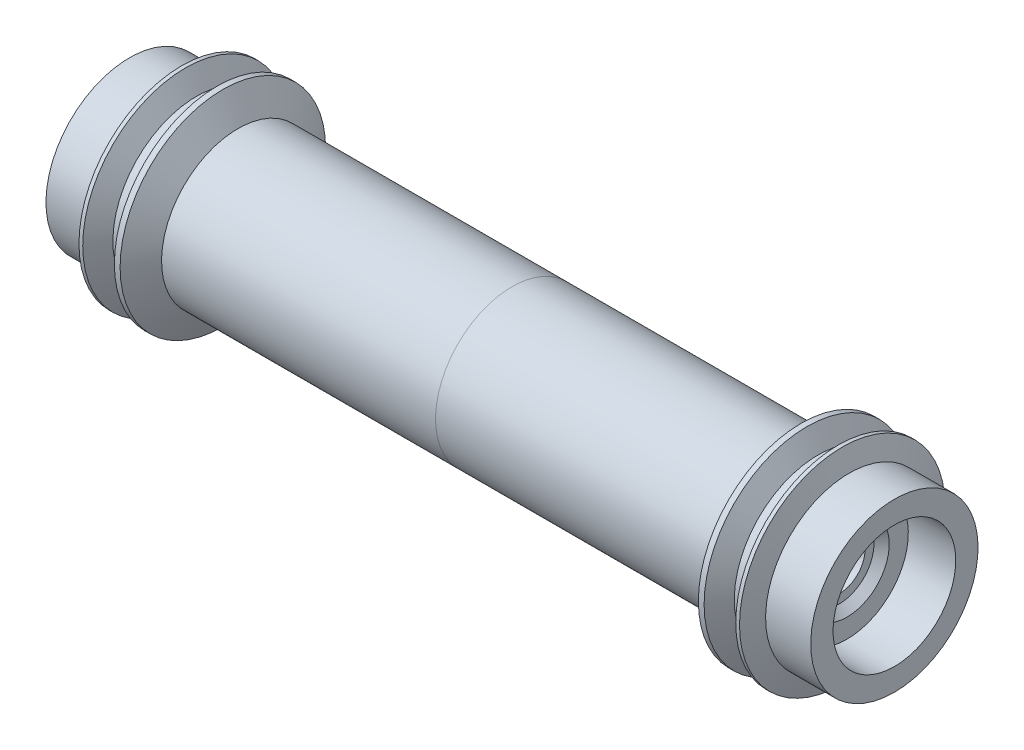
ISO-10303-21;
HEADER;
FILE_DESCRIPTION(('STEP AP214'),'2;1');
FILE_NAME('part.step','',(''),(''),'','','');
FILE_SCHEMA(('AUTOMOTIVE_DESIGN { 1 0 10303 214 1 1 1 1 }'));
ENDSEC;
DATA;
#1=APPLICATION_CONTEXT('core data for automotive mechanical design processes');
#2=APPLICATION_PROTOCOL_DEFINITION('international standard','automotive_design',2000,#1);
#3=PRODUCT_CONTEXT('',#1,'mechanical');
#4=PRODUCT('Part','Part','',(#3));
#5=PRODUCT_RELATED_PRODUCT_CATEGORY('part','',(#4));
#6=PRODUCT_DEFINITION_FORMATION('','',#4);
#7=PRODUCT_DEFINITION_CONTEXT('part definition',#1,'design');
#8=PRODUCT_DEFINITION('design','',#6,#7);
#9=PRODUCT_DEFINITION_SHAPE('','',#8);
#10=(LENGTH_UNIT() NAMED_UNIT(*) SI_UNIT(.MILLI.,.METRE.));
#11=(NAMED_UNIT(*) PLANE_ANGLE_UNIT() SI_UNIT($,.RADIAN.));
#12=(NAMED_UNIT(*) SI_UNIT($,.STERADIAN.) SOLID_ANGLE_UNIT());
#13=UNCERTAINTY_MEASURE_WITH_UNIT(LENGTH_MEASURE(1.E-05),#10,'distance_accuracy_value','');
#14=(GEOMETRIC_REPRESENTATION_CONTEXT(3) GLOBAL_UNCERTAINTY_ASSIGNED_CONTEXT((#13)) GLOBAL_UNIT_ASSIGNED_CONTEXT((#10,
#11,#12)) REPRESENTATION_CONTEXT('',''));
#15=CARTESIAN_POINT('',(0.,0.,0.));
#16=DIRECTION('',(0.,0.,1.));
#17=DIRECTION('',(1.,0.,0.));
#18=AXIS2_PLACEMENT_3D('',#15,#16,#17);
#19=CARTESIAN_POINT('',(21.6882348418708,0.,0.));
#20=DIRECTION('',(1.,0.,0.));
#21=DIRECTION('',(0.,-1.,0.));
#22=AXIS2_PLACEMENT_3D('',#19,#20,#21);
#23=CONICAL_SURFACE('',#22,6.82625,1.0471975511966);
#24=CARTESIAN_POINT('',(20.955,0.,0.));
#25=DIRECTION('',(-1.,0.,0.));
#26=DIRECTION('',(0.,-1.,0.));
#27=AXIS2_PLACEMENT_3D('',#24,#25,#26);
#28=CIRCLE('',#27,5.55625);
#29=CARTESIAN_POINT('',(20.955,-5.55625,0.));
#30=VERTEX_POINT('',#29);
#31=EDGE_CURVE('E157',#30,#30,#28,.T.);
#32=ORIENTED_EDGE('',*,*,#31,.F.);
#33=EDGE_LOOP('',(#32));
#34=FACE_BOUND('',#33,.T.);
#35=CARTESIAN_POINT('',(21.6882348418708,0.,0.));
#36=DIRECTION('',(-1.,0.,0.));
#37=DIRECTION('',(0.,-1.,0.));
#38=AXIS2_PLACEMENT_3D('',#35,#36,#37);
#39=CIRCLE('',#38,6.82625);
#40=CARTESIAN_POINT('',(21.6882348418708,-6.82625,0.));
#41=VERTEX_POINT('',#40);
#42=EDGE_CURVE('E12',#41,#41,#39,.T.);
#43=ORIENTED_EDGE('',*,*,#42,.T.);
#44=EDGE_LOOP('',(#43));
#45=FACE_BOUND('',#44,.T.);
#46=ADVANCED_FACE('F59',(#34,#45),#23,.T.);
#47=CARTESIAN_POINT('',(25.4,0.,0.));
#48=DIRECTION('',(1.,0.,0.));
#49=DIRECTION('',(0.,-1.,0.));
#50=AXIS2_PLACEMENT_3D('',#47,#48,#49);
#51=CYLINDRICAL_SURFACE('',#50,6.82625);
#52=ORIENTED_EDGE('',*,*,#42,.F.);
#53=EDGE_LOOP('',(#52));
#54=FACE_BOUND('',#53,.T.);
#55=CARTESIAN_POINT('',(21.9377578024819,0.,0.));
#56=DIRECTION('',(-1.,0.,0.));
#57=DIRECTION('',(0.,-1.,0.));
#58=AXIS2_PLACEMENT_3D('',#55,#56,#57);
#59=CIRCLE('',#58,6.82625);
#60=CARTESIAN_POINT('',(21.9377578024819,-6.82625,0.));
#61=VERTEX_POINT('',#60);
#62=EDGE_CURVE('E66',#61,#61,#59,.T.);
#63=ORIENTED_EDGE('',*,*,#62,.T.);
#64=EDGE_LOOP('',(#63));
#65=FACE_BOUND('',#64,.T.);
#66=ADVANCED_FACE('F123',(#54,#65),#51,.T.);
#67=CARTESIAN_POINT('',(22.4,0.,0.));
#68=DIRECTION('',(-1.,0.,0.));
#69=DIRECTION('',(0.,1.,0.));
#70=AXIS2_PLACEMENT_3D('',#67,#68,#69);
#71=CONICAL_SURFACE('',#70,5.55625,1.22173047639603);
#72=ORIENTED_EDGE('',*,*,#62,.F.);
#73=EDGE_LOOP('',(#72));
#74=FACE_BOUND('',#73,.T.);
#75=CARTESIAN_POINT('',(22.4,0.,0.));
#76=DIRECTION('',(-1.,0.,0.));
#77=DIRECTION('',(0.,-1.,0.));
#78=AXIS2_PLACEMENT_3D('',#75,#76,#77);
#79=CIRCLE('',#78,5.55625);
#80=CARTESIAN_POINT('',(22.4,-5.55625,0.));
#81=VERTEX_POINT('',#80);
#82=EDGE_CURVE('E116',#81,#81,#79,.T.);
#83=ORIENTED_EDGE('',*,*,#82,.T.);
#84=EDGE_LOOP('',(#83));
#85=FACE_BOUND('',#84,.T.);
#86=ADVANCED_FACE('F125',(#74,#85),#71,.T.);
#87=CARTESIAN_POINT('',(25.4,0.,0.));
#88=DIRECTION('',(1.,0.,0.));
#89=DIRECTION('',(0.,-1.,0.));
#90=AXIS2_PLACEMENT_3D('',#87,#88,#89);
#91=CYLINDRICAL_SURFACE('',#90,5.55625);
#92=ORIENTED_EDGE('',*,*,#82,.F.);
#93=EDGE_LOOP('',(#92));
#94=FACE_BOUND('',#93,.T.);
#95=CARTESIAN_POINT('',(25.4,0.,0.));
#96=DIRECTION('',(-1.,0.,0.));
#97=DIRECTION('',(0.,-1.,0.));
#98=AXIS2_PLACEMENT_3D('',#95,#96,#97);
#99=CIRCLE('',#98,5.55625);
#100=CARTESIAN_POINT('',(25.4,-5.55625,0.));
#101=VERTEX_POINT('',#100);
#102=EDGE_CURVE('E112',#101,#101,#99,.T.);
#103=ORIENTED_EDGE('',*,*,#102,.T.);
#104=EDGE_LOOP('',(#103));
#105=FACE_BOUND('',#104,.T.);
#106=ADVANCED_FACE('F128',(#94,#105),#91,.T.);
#107=CARTESIAN_POINT('',(25.4,0.,0.));
#108=DIRECTION('',(-1.,0.,0.));
#109=DIRECTION('',(0.,1.,0.));
#110=AXIS2_PLACEMENT_3D('',#107,#108,#109);
#111=PLANE('',#110);
#112=CARTESIAN_POINT('',(25.4,0.,0.));
#113=DIRECTION('',(-1.,0.,0.));
#114=DIRECTION('',(0.,-1.,0.));
#115=AXIS2_PLACEMENT_3D('',#112,#113,#114);
#116=CIRCLE('',#115,4.075);
#117=CARTESIAN_POINT('',(25.4,-4.075,0.));
#118=VERTEX_POINT('',#117);
#119=EDGE_CURVE('E108',#118,#118,#116,.T.);
#120=ORIENTED_EDGE('',*,*,#119,.T.);
#121=EDGE_LOOP('',(#120));
#122=FACE_BOUND('',#121,.T.);
#123=ORIENTED_EDGE('',*,*,#102,.F.);
#124=EDGE_LOOP('',(#123));
#125=FACE_BOUND('',#124,.T.);
#126=ADVANCED_FACE('F134',(#122,#125),#111,.F.);
#127=CARTESIAN_POINT('',(25.4,0.,0.));
#128=DIRECTION('',(1.,0.,0.));
#129=DIRECTION('',(0.,-1.,0.));
#130=AXIS2_PLACEMENT_3D('',#127,#128,#129);
#131=CYLINDRICAL_SURFACE('',#130,4.075);
#132=CARTESIAN_POINT('',(22.25,0.,0.));
#133=DIRECTION('',(-1.,0.,0.));
#134=DIRECTION('',(0.,-1.,0.));
#135=AXIS2_PLACEMENT_3D('',#132,#133,#134);
#136=CIRCLE('',#135,4.075);
#137=CARTESIAN_POINT('',(22.25,-4.075,0.));
#138=VERTEX_POINT('',#137);
#139=EDGE_CURVE('E104',#138,#138,#136,.T.);
#140=ORIENTED_EDGE('',*,*,#139,.T.);
#141=EDGE_LOOP('',(#140));
#142=FACE_BOUND('',#141,.T.);
#143=ORIENTED_EDGE('',*,*,#119,.F.);
#144=EDGE_LOOP('',(#143));
#145=FACE_BOUND('',#144,.T.);
#146=ADVANCED_FACE('F139',(#142,#145),#131,.F.);
#147=CARTESIAN_POINT('',(22.25,0.,0.));
#148=DIRECTION('',(-1.,0.,0.));
#149=DIRECTION('',(0.,1.,0.));
#150=AXIS2_PLACEMENT_3D('',#147,#148,#149);
#151=PLANE('',#150);
#152=CARTESIAN_POINT('',(22.25,0.,0.));
#153=DIRECTION('',(-1.,0.,0.));
#154=DIRECTION('',(0.,-1.,0.));
#155=AXIS2_PLACEMENT_3D('',#152,#153,#154);
#156=CIRCLE('',#155,2.805);
#157=CARTESIAN_POINT('',(22.25,-2.805,0.));
#158=VERTEX_POINT('',#157);
#159=EDGE_CURVE('E100',#158,#158,#156,.T.);
#160=ORIENTED_EDGE('',*,*,#159,.T.);
#161=EDGE_LOOP('',(#160));
#162=FACE_BOUND('',#161,.T.);
#163=ORIENTED_EDGE('',*,*,#139,.F.);
#164=EDGE_LOOP('',(#163));
#165=FACE_BOUND('',#164,.T.);
#166=ADVANCED_FACE('F145',(#162,#165),#151,.F.);
#167=CARTESIAN_POINT('',(22.25,0.,0.));
#168=DIRECTION('',(1.,0.,0.));
#169=DIRECTION('',(0.,-1.,0.));
#170=AXIS2_PLACEMENT_3D('',#167,#168,#169);
#171=CONICAL_SURFACE('',#170,2.805,0.785398163397447);
#172=CARTESIAN_POINT('',(21.742,0.,0.));
#173=DIRECTION('',(-1.,0.,0.));
#174=DIRECTION('',(0.,-1.,0.));
#175=AXIS2_PLACEMENT_3D('',#172,#173,#174);
#176=CIRCLE('',#175,2.297);
#177=CARTESIAN_POINT('',(21.742,-2.297,0.));
#178=VERTEX_POINT('',#177);
#179=EDGE_CURVE('E96',#178,#178,#176,.T.);
#180=ORIENTED_EDGE('',*,*,#179,.T.);
#181=EDGE_LOOP('',(#180));
#182=FACE_BOUND('',#181,.T.);
#183=ORIENTED_EDGE('',*,*,#159,.F.);
#184=EDGE_LOOP('',(#183));
#185=FACE_BOUND('',#184,.T.);
#186=ADVANCED_FACE('F229',(#182,#185),#171,.F.);
#187=CARTESIAN_POINT('',(21.742,0.,0.));
#188=DIRECTION('',(-1.,0.,0.));
#189=DIRECTION('',(0.,1.,0.));
#190=AXIS2_PLACEMENT_3D('',#187,#188,#189);
#191=PLANE('',#190);
#192=CARTESIAN_POINT('',(21.742,0.,0.));
#193=DIRECTION('',(-1.,0.,0.));
#194=DIRECTION('',(0.,-1.,0.));
#195=AXIS2_PLACEMENT_3D('',#192,#193,#194);
#196=CIRCLE('',#195,1.7145);
#197=CARTESIAN_POINT('',(21.742,-1.7145,0.));
#198=VERTEX_POINT('',#197);
#199=EDGE_CURVE('E86',#198,#198,#196,.T.);
#200=ORIENTED_EDGE('',*,*,#199,.T.);
#201=EDGE_LOOP('',(#200));
#202=FACE_BOUND('',#201,.T.);
#203=ORIENTED_EDGE('',*,*,#179,.F.);
#204=EDGE_LOOP('',(#203));
#205=FACE_BOUND('',#204,.T.);
#206=ADVANCED_FACE('F225',(#202,#205),#191,.F.);
#207=CARTESIAN_POINT('',(25.4,0.,0.));
#208=DIRECTION('',(1.,0.,0.));
#209=DIRECTION('',(0.,-1.,0.));
#210=AXIS2_PLACEMENT_3D('',#207,#208,#209);
#211=CYLINDRICAL_SURFACE('',#210,1.7145);
#212=CARTESIAN_POINT('',(15.575,0.,0.));
#213=DIRECTION('',(-1.,0.,0.));
#214=DIRECTION('',(0.,-1.,0.));
#215=AXIS2_PLACEMENT_3D('',#212,#213,#214);
#216=CIRCLE('',#215,1.7145);
#217=CARTESIAN_POINT('',(15.575,-1.7145,0.));
#218=VERTEX_POINT('',#217);
#219=EDGE_CURVE('E80',#218,#218,#216,.T.);
#220=ORIENTED_EDGE('',*,*,#219,.T.);
#221=EDGE_LOOP('',(#220));
#222=FACE_BOUND('',#221,.T.);
#223=ORIENTED_EDGE('',*,*,#199,.F.);
#224=EDGE_LOOP('',(#223));
#225=FACE_BOUND('',#224,.T.);
#226=ADVANCED_FACE('F221',(#222,#225),#211,.F.);
#227=CARTESIAN_POINT('',(15.575,0.,0.));
#228=DIRECTION('',(-1.,0.,0.));
#229=DIRECTION('',(0.,1.,0.));
#230=AXIS2_PLACEMENT_3D('',#227,#228,#229);
#231=PLANE('',#230);
#232=ORIENTED_EDGE('',*,*,#219,.F.);
#233=EDGE_LOOP('',(#232));
#234=FACE_BOUND('',#233,.T.);
#235=ADVANCED_FACE('F73',(#234),#231,.F.);
#236=CARTESIAN_POINT('',(12.5,0.,0.));
#237=DIRECTION('',(-1.,0.,0.));
#238=DIRECTION('',(0.,1.,0.));
#239=AXIS2_PLACEMENT_3D('',#236,#237,#238);
#240=CONICAL_SURFACE('',#239,1.6,0.78539816339745);
#241=CARTESIAN_POINT('',(14.1,0.,0.));
#242=VERTEX_POINT('',#241);
#243=VERTEX_LOOP('',#242);
#244=FACE_BOUND('',#243,.T.);
#245=CARTESIAN_POINT('',(12.5,0.,0.));
#246=DIRECTION('',(-1.,0.,0.));
#247=DIRECTION('',(0.,-1.,0.));
#248=AXIS2_PLACEMENT_3D('',#245,#246,#247);
#249=CIRCLE('',#248,1.6);
#250=CARTESIAN_POINT('',(12.5,-1.6,0.));
#251=VERTEX_POINT('',#250);
#252=EDGE_CURVE('E77',#251,#251,#249,.T.);
#253=ORIENTED_EDGE('',*,*,#252,.T.);
#254=EDGE_LOOP('',(#253));
#255=FACE_BOUND('',#254,.T.);
#256=ADVANCED_FACE('F69',(#244,#255),#240,.F.);
#257=CARTESIAN_POINT('',(25.4,0.,0.));
#258=DIRECTION('',(1.,0.,0.));
#259=DIRECTION('',(0.,-1.,0.));
#260=AXIS2_PLACEMENT_3D('',#257,#258,#259);
#261=CYLINDRICAL_SURFACE('',#260,1.6);
#262=ORIENTED_EDGE('',*,*,#252,.F.);
#263=EDGE_LOOP('',(#262));
#264=FACE_BOUND('',#263,.T.);
#265=CARTESIAN_POINT('',(0.,0.,0.));
#266=DIRECTION('',(-1.,0.,0.));
#267=DIRECTION('',(0.,-1.,0.));
#268=AXIS2_PLACEMENT_3D('',#265,#266,#267);
#269=CIRCLE('',#268,1.6);
#270=CARTESIAN_POINT('',(0.,-1.6,0.));
#271=VERTEX_POINT('',#270);
#272=EDGE_CURVE('E81',#271,#271,#269,.T.);
#273=ORIENTED_EDGE('',*,*,#272,.T.);
#274=EDGE_LOOP('',(#273));
#275=FACE_BOUND('',#274,.T.);
#276=ADVANCED_FACE('F72',(#264,#275),#261,.F.);
#277=CARTESIAN_POINT('',(0.,0.,0.));
#278=DIRECTION('',(1.,0.,0.));
#279=DIRECTION('',(0.,-1.,0.));
#280=AXIS2_PLACEMENT_3D('',#277,#278,#279);
#281=PLANE('',#280);
#282=CARTESIAN_POINT('',(0.,0.,0.));
#283=DIRECTION('',(-1.,0.,0.));
#284=DIRECTION('',(0.,-1.,0.));
#285=AXIS2_PLACEMENT_3D('',#282,#283,#284);
#286=CIRCLE('',#285,5.08);
#287=CARTESIAN_POINT('',(0.,-5.08,0.));
#288=VERTEX_POINT('',#287);
#289=EDGE_CURVE('E89',#288,#288,#286,.T.);
#290=ORIENTED_EDGE('',*,*,#289,.T.);
#291=EDGE_LOOP('',(#290));
#292=FACE_BOUND('',#291,.T.);
#293=ORIENTED_EDGE('',*,*,#272,.F.);
#294=EDGE_LOOP('',(#293));
#295=FACE_BOUND('',#294,.T.);
#296=ADVANCED_FACE('F182',(#292,#295),#281,.F.);
#297=CARTESIAN_POINT('',(25.4,0.,0.));
#298=DIRECTION('',(1.,0.,0.));
#299=DIRECTION('',(0.,-1.,0.));
#300=AXIS2_PLACEMENT_3D('',#297,#298,#299);
#301=CYLINDRICAL_SURFACE('',#300,5.08);
#302=ORIENTED_EDGE('',*,*,#289,.F.);
#303=EDGE_LOOP('',(#302));
#304=FACE_BOUND('',#303,.T.);
#305=CARTESIAN_POINT('',(18.1975672505568,0.,0.));
#306=DIRECTION('',(-1.,0.,0.));
#307=DIRECTION('',(0.,-1.,0.));
#308=AXIS2_PLACEMENT_3D('',#305,#306,#307);
#309=CIRCLE('',#308,5.08);
#310=CARTESIAN_POINT('',(18.1975672505568,-5.08,0.));
#311=VERTEX_POINT('',#310);
#312=EDGE_CURVE('E175',#311,#311,#309,.T.);
#313=ORIENTED_EDGE('',*,*,#312,.T.);
#314=EDGE_LOOP('',(#313));
#315=FACE_BOUND('',#314,.T.);
#316=ADVANCED_FACE('F185',(#304,#315),#301,.T.);
#317=CARTESIAN_POINT('',(19.2057651581292,0.,0.));
#318=DIRECTION('',(1.,0.,0.));
#319=DIRECTION('',(0.,-1.,0.));
#320=AXIS2_PLACEMENT_3D('',#317,#318,#319);
#321=CONICAL_SURFACE('',#320,6.82625,1.0471975511966);
#322=ORIENTED_EDGE('',*,*,#312,.F.);
#323=EDGE_LOOP('',(#322));
#324=FACE_BOUND('',#323,.T.);
#325=CARTESIAN_POINT('',(19.2057651581292,0.,0.));
#326=DIRECTION('',(-1.,0.,0.));
#327=DIRECTION('',(0.,-1.,0.));
#328=AXIS2_PLACEMENT_3D('',#325,#326,#327);
#329=CIRCLE('',#328,6.82625);
#330=CARTESIAN_POINT('',(19.2057651581292,-6.82625,0.));
#331=VERTEX_POINT('',#330);
#332=EDGE_CURVE('E171',#331,#331,#329,.T.);
#333=ORIENTED_EDGE('',*,*,#332,.T.);
#334=EDGE_LOOP('',(#333));
#335=FACE_BOUND('',#334,.T.);
#336=ADVANCED_FACE('F188',(#324,#335),#321,.T.);
#337=CARTESIAN_POINT('',(25.4,0.,0.));
#338=DIRECTION('',(1.,0.,0.));
#339=DIRECTION('',(0.,-1.,0.));
#340=AXIS2_PLACEMENT_3D('',#337,#338,#339);
#341=CYLINDRICAL_SURFACE('',#340,6.82625);
#342=ORIENTED_EDGE('',*,*,#332,.F.);
#343=EDGE_LOOP('',(#342));
#344=FACE_BOUND('',#343,.T.);
#345=CARTESIAN_POINT('',(19.5867651581292,0.,0.));
#346=DIRECTION('',(-1.,0.,0.));
#347=DIRECTION('',(0.,-1.,0.));
#348=AXIS2_PLACEMENT_3D('',#345,#346,#347);
#349=CIRCLE('',#348,6.82625);
#350=CARTESIAN_POINT('',(19.5867651581292,-6.82625,0.));
#351=VERTEX_POINT('',#350);
#352=EDGE_CURVE('E165',#351,#351,#349,.T.);
#353=ORIENTED_EDGE('',*,*,#352,.T.);
#354=EDGE_LOOP('',(#353));
#355=FACE_BOUND('',#354,.T.);
#356=ADVANCED_FACE('F194',(#344,#355),#341,.T.);
#357=CARTESIAN_POINT('',(20.32,0.,0.));
#358=DIRECTION('',(-1.,0.,0.));
#359=DIRECTION('',(0.,1.,0.));
#360=AXIS2_PLACEMENT_3D('',#357,#358,#359);
#361=CONICAL_SURFACE('',#360,5.55625,1.0471975511966);
#362=ORIENTED_EDGE('',*,*,#352,.F.);
#363=EDGE_LOOP('',(#362));
#364=FACE_BOUND('',#363,.T.);
#365=CARTESIAN_POINT('',(20.32,0.,0.));
#366=DIRECTION('',(-1.,0.,0.));
#367=DIRECTION('',(0.,-1.,0.));
#368=AXIS2_PLACEMENT_3D('',#365,#366,#367);
#369=CIRCLE('',#368,5.55625);
#370=CARTESIAN_POINT('',(20.32,-5.55625,0.));
#371=VERTEX_POINT('',#370);
#372=EDGE_CURVE('E161',#371,#371,#369,.T.);
#373=ORIENTED_EDGE('',*,*,#372,.T.);
#374=EDGE_LOOP('',(#373));
#375=FACE_BOUND('',#374,.T.);
#376=ADVANCED_FACE('F200',(#364,#375),#361,.T.);
#377=CARTESIAN_POINT('',(25.4,0.,0.));
#378=DIRECTION('',(1.,0.,0.));
#379=DIRECTION('',(0.,-1.,0.));
#380=AXIS2_PLACEMENT_3D('',#377,#378,#379);
#381=CYLINDRICAL_SURFACE('',#380,5.55625);
#382=ORIENTED_EDGE('',*,*,#372,.F.);
#383=EDGE_LOOP('',(#382));
#384=FACE_BOUND('',#383,.T.);
#385=ORIENTED_EDGE('',*,*,#31,.T.);
#386=EDGE_LOOP('',(#385));
#387=FACE_BOUND('',#386,.T.);
#388=ADVANCED_FACE('F206',(#384,#387),#381,.T.);
#389=CLOSED_SHELL('',(#46,#66,#86,#106,#126,#146,#166,#186,#206,#226,#235,#256,#276,#296,#316,
#336,#356,#376,#388));
#390=MANIFOLD_SOLID_BREP('B2',#389);
#391=CARTESIAN_POINT('',(-21.6882348418708,0.,0.));
#392=DIRECTION('',(-1.,0.,0.));
#393=DIRECTION('',(0.,-1.,0.));
#394=AXIS2_PLACEMENT_3D('',#391,#392,#393);
#395=CONICAL_SURFACE('',#394,6.82625,1.0471975511966);
#396=CARTESIAN_POINT('',(-20.955,0.,0.));
#397=DIRECTION('',(-1.,0.,0.));
#398=DIRECTION('',(0.,-1.,0.));
#399=AXIS2_PLACEMENT_3D('',#396,#397,#398);
#400=CIRCLE('',#399,5.55625);
#401=CARTESIAN_POINT('',(-20.955,-5.55625,0.));
#402=VERTEX_POINT('',#401);
#403=EDGE_CURVE('E503',#402,#402,#400,.T.);
#404=ORIENTED_EDGE('',*,*,#403,.T.);
#405=EDGE_LOOP('',(#404));
#406=FACE_BOUND('',#405,.T.);
#407=CARTESIAN_POINT('',(-21.6882348418708,0.,0.));
#408=DIRECTION('',(-1.,0.,0.));
#409=DIRECTION('',(0.,-1.,0.));
#410=AXIS2_PLACEMENT_3D('',#407,#408,#409);
#411=CIRCLE('',#410,6.82625);
#412=CARTESIAN_POINT('',(-21.6882348418708,-6.82625,0.));
#413=VERTEX_POINT('',#412);
#414=EDGE_CURVE('E412',#413,#413,#411,.T.);
#415=ORIENTED_EDGE('',*,*,#414,.F.);
#416=EDGE_LOOP('',(#415));
#417=FACE_BOUND('',#416,.T.);
#418=ADVANCED_FACE('F360',(#406,#417),#395,.T.);
#419=CARTESIAN_POINT('',(-25.4,0.,0.));
#420=DIRECTION('',(-1.,0.,0.));
#421=DIRECTION('',(0.,-1.,0.));
#422=AXIS2_PLACEMENT_3D('',#419,#420,#421);
#423=CYLINDRICAL_SURFACE('',#422,6.82625);
#424=ORIENTED_EDGE('',*,*,#414,.T.);
#425=EDGE_LOOP('',(#424));
#426=FACE_BOUND('',#425,.T.);
#427=CARTESIAN_POINT('',(-21.9377578024819,0.,0.));
#428=DIRECTION('',(-1.,0.,0.));
#429=DIRECTION('',(0.,-1.,0.));
#430=AXIS2_PLACEMENT_3D('',#427,#428,#429);
#431=CIRCLE('',#430,6.82625);
#432=CARTESIAN_POINT('',(-21.9377578024819,-6.82625,0.));
#433=VERTEX_POINT('',#432);
#434=EDGE_CURVE('E409',#433,#433,#431,.T.);
#435=ORIENTED_EDGE('',*,*,#434,.F.);
#436=EDGE_LOOP('',(#435));
#437=FACE_BOUND('',#436,.T.);
#438=ADVANCED_FACE('F432',(#426,#437),#423,.T.);
#439=CARTESIAN_POINT('',(-22.4,0.,0.));
#440=DIRECTION('',(1.,0.,0.));
#441=DIRECTION('',(0.,1.,0.));
#442=AXIS2_PLACEMENT_3D('',#439,#440,#441);
#443=CONICAL_SURFACE('',#442,5.55625,1.22173047639603);
#444=ORIENTED_EDGE('',*,*,#434,.T.);
#445=EDGE_LOOP('',(#444));
#446=FACE_BOUND('',#445,.T.);
#447=CARTESIAN_POINT('',(-22.4,0.,0.));
#448=DIRECTION('',(-1.,0.,0.));
#449=DIRECTION('',(0.,-1.,0.));
#450=AXIS2_PLACEMENT_3D('',#447,#448,#449);
#451=CIRCLE('',#450,5.55625);
#452=CARTESIAN_POINT('',(-22.4,-5.55625,0.));
#453=VERTEX_POINT('',#452);
#454=EDGE_CURVE('E406',#453,#453,#451,.T.);
#455=ORIENTED_EDGE('',*,*,#454,.F.);
#456=EDGE_LOOP('',(#455));
#457=FACE_BOUND('',#456,.T.);
#458=ADVANCED_FACE('F437',(#446,#457),#443,.T.);
#459=CARTESIAN_POINT('',(-25.4,0.,0.));
#460=DIRECTION('',(-1.,0.,0.));
#461=DIRECTION('',(0.,-1.,0.));
#462=AXIS2_PLACEMENT_3D('',#459,#460,#461);
#463=CYLINDRICAL_SURFACE('',#462,5.55625);
#464=ORIENTED_EDGE('',*,*,#454,.T.);
#465=EDGE_LOOP('',(#464));
#466=FACE_BOUND('',#465,.T.);
#467=CARTESIAN_POINT('',(-25.4,0.,0.));
#468=DIRECTION('',(-1.,0.,0.));
#469=DIRECTION('',(0.,-1.,0.));
#470=AXIS2_PLACEMENT_3D('',#467,#468,#469);
#471=CIRCLE('',#470,5.55625);
#472=CARTESIAN_POINT('',(-25.4,-5.55625,0.));
#473=VERTEX_POINT('',#472);
#474=EDGE_CURVE('E403',#473,#473,#471,.T.);
#475=ORIENTED_EDGE('',*,*,#474,.F.);
#476=EDGE_LOOP('',(#475));
#477=FACE_BOUND('',#476,.T.);
#478=ADVANCED_FACE('F445',(#466,#477),#463,.T.);
#479=CARTESIAN_POINT('',(-25.4,0.,0.));
#480=DIRECTION('',(1.,0.,0.));
#481=DIRECTION('',(0.,1.,0.));
#482=AXIS2_PLACEMENT_3D('',#479,#480,#481);
#483=PLANE('',#482);
#484=CARTESIAN_POINT('',(-25.4,0.,0.));
#485=DIRECTION('',(1.,0.,0.));
#486=DIRECTION('',(0.,1.,0.));
#487=AXIS2_PLACEMENT_3D('',#484,#485,#486);
#488=CIRCLE('',#487,4.58300000000001);
#489=CARTESIAN_POINT('',(-25.4,4.58300000000001,0.));
#490=VERTEX_POINT('',#489);
#491=EDGE_CURVE('E57',#490,#490,#488,.T.);
#492=ORIENTED_EDGE('',*,*,#491,.T.);
#493=EDGE_LOOP('',(#492));
#494=FACE_BOUND('',#493,.T.);
#495=ORIENTED_EDGE('',*,*,#474,.T.);
#496=EDGE_LOOP('',(#495));
#497=FACE_BOUND('',#496,.T.);
#498=ADVANCED_FACE('F449',(#494,#497),#483,.F.);
#499=CARTESIAN_POINT('',(-25.4,0.,0.));
#500=DIRECTION('',(-1.,0.,0.));
#501=DIRECTION('',(0.,-1.,0.));
#502=AXIS2_PLACEMENT_3D('',#499,#500,#501);
#503=CYLINDRICAL_SURFACE('',#502,4.075);
#504=CARTESIAN_POINT('',(-24.892,0.,0.));
#505=DIRECTION('',(1.,0.,0.));
#506=DIRECTION('',(0.,1.,0.));
#507=AXIS2_PLACEMENT_3D('',#504,#505,#506);
#508=CIRCLE('',#507,4.075);
#509=CARTESIAN_POINT('',(-24.892,4.075,0.));
#510=VERTEX_POINT('',#509);
#511=EDGE_CURVE('E368',#510,#510,#508,.F.);
#512=ORIENTED_EDGE('',*,*,#511,.T.);
#513=EDGE_LOOP('',(#512));
#514=FACE_BOUND('',#513,.T.);
#515=CARTESIAN_POINT('',(-22.25,0.,0.));
#516=DIRECTION('',(-1.,0.,0.));
#517=DIRECTION('',(0.,-1.,0.));
#518=AXIS2_PLACEMENT_3D('',#515,#516,#517);
#519=CIRCLE('',#518,4.075);
#520=CARTESIAN_POINT('',(-22.25,-4.075,0.));
#521=VERTEX_POINT('',#520);
#522=EDGE_CURVE('E400',#521,#521,#519,.T.);
#523=ORIENTED_EDGE('',*,*,#522,.F.);
#524=EDGE_LOOP('',(#523));
#525=FACE_BOUND('',#524,.T.);
#526=ADVANCED_FACE('F417',(#514,#525),#503,.F.);
#527=CARTESIAN_POINT('',(-22.25,0.,0.));
#528=DIRECTION('',(1.,0.,0.));
#529=DIRECTION('',(0.,1.,0.));
#530=AXIS2_PLACEMENT_3D('',#527,#528,#529);
#531=PLANE('',#530);
#532=CARTESIAN_POINT('',(-22.25,0.,0.));
#533=DIRECTION('',(-1.,0.,0.));
#534=DIRECTION('',(0.,-1.,0.));
#535=AXIS2_PLACEMENT_3D('',#532,#533,#534);
#536=CIRCLE('',#535,2.805);
#537=CARTESIAN_POINT('',(-22.25,-2.805,0.));
#538=VERTEX_POINT('',#537);
#539=EDGE_CURVE('E397',#538,#538,#536,.T.);
#540=ORIENTED_EDGE('',*,*,#539,.F.);
#541=EDGE_LOOP('',(#540));
#542=FACE_BOUND('',#541,.T.);
#543=ORIENTED_EDGE('',*,*,#522,.T.);
#544=EDGE_LOOP('',(#543));
#545=FACE_BOUND('',#544,.T.);
#546=ADVANCED_FACE('F455',(#542,#545),#531,.F.);
#547=CARTESIAN_POINT('',(-22.25,0.,0.));
#548=DIRECTION('',(-1.,0.,0.));
#549=DIRECTION('',(0.,-1.,0.));
#550=AXIS2_PLACEMENT_3D('',#547,#548,#549);
#551=CONICAL_SURFACE('',#550,2.805,0.785398163397447);
#552=CARTESIAN_POINT('',(-21.742,0.,0.));
#553=DIRECTION('',(-1.,0.,0.));
#554=DIRECTION('',(0.,-1.,0.));
#555=AXIS2_PLACEMENT_3D('',#552,#553,#554);
#556=CIRCLE('',#555,2.297);
#557=CARTESIAN_POINT('',(-21.742,-2.297,0.));
#558=VERTEX_POINT('',#557);
#559=EDGE_CURVE('E394',#558,#558,#556,.T.);
#560=ORIENTED_EDGE('',*,*,#559,.F.);
#561=EDGE_LOOP('',(#560));
#562=FACE_BOUND('',#561,.T.);
#563=ORIENTED_EDGE('',*,*,#539,.T.);
#564=EDGE_LOOP('',(#563));
#565=FACE_BOUND('',#564,.T.);
#566=ADVANCED_FACE('F458',(#562,#565),#551,.F.);
#567=CARTESIAN_POINT('',(-21.742,0.,0.));
#568=DIRECTION('',(1.,0.,0.));
#569=DIRECTION('',(0.,1.,0.));
#570=AXIS2_PLACEMENT_3D('',#567,#568,#569);
#571=PLANE('',#570);
#572=CARTESIAN_POINT('',(-21.742,0.,0.));
#573=DIRECTION('',(-1.,0.,0.));
#574=DIRECTION('',(0.,-1.,0.));
#575=AXIS2_PLACEMENT_3D('',#572,#573,#574);
#576=CIRCLE('',#575,1.7145);
#577=CARTESIAN_POINT('',(-21.742,-1.7145,0.));
#578=VERTEX_POINT('',#577);
#579=EDGE_CURVE('E385',#578,#578,#576,.T.);
#580=ORIENTED_EDGE('',*,*,#579,.F.);
#581=EDGE_LOOP('',(#580));
#582=FACE_BOUND('',#581,.T.);
#583=ORIENTED_EDGE('',*,*,#559,.T.);
#584=EDGE_LOOP('',(#583));
#585=FACE_BOUND('',#584,.T.);
#586=ADVANCED_FACE('F462',(#582,#585),#571,.F.);
#587=CARTESIAN_POINT('',(-25.4,0.,0.));
#588=DIRECTION('',(-1.,0.,0.));
#589=DIRECTION('',(0.,-1.,0.));
#590=AXIS2_PLACEMENT_3D('',#587,#588,#589);
#591=CYLINDRICAL_SURFACE('',#590,1.7145);
#592=CARTESIAN_POINT('',(-15.575,0.,0.));
#593=DIRECTION('',(-1.,0.,0.));
#594=DIRECTION('',(0.,-1.,0.));
#595=AXIS2_PLACEMENT_3D('',#592,#593,#594);
#596=CIRCLE('',#595,1.7145);
#597=CARTESIAN_POINT('',(-15.575,-1.7145,0.));
#598=VERTEX_POINT('',#597);
#599=EDGE_CURVE('E381',#598,#598,#596,.T.);
#600=ORIENTED_EDGE('',*,*,#599,.F.);
#601=EDGE_LOOP('',(#600));
#602=FACE_BOUND('',#601,.T.);
#603=ORIENTED_EDGE('',*,*,#579,.T.);
#604=EDGE_LOOP('',(#603));
#605=FACE_BOUND('',#604,.T.);
#606=ADVANCED_FACE('F466',(#602,#605),#591,.F.);
#607=CARTESIAN_POINT('',(-15.575,0.,0.));
#608=DIRECTION('',(1.,0.,0.));
#609=DIRECTION('',(0.,1.,0.));
#610=AXIS2_PLACEMENT_3D('',#607,#608,#609);
#611=PLANE('',#610);
#612=ORIENTED_EDGE('',*,*,#599,.T.);
#613=EDGE_LOOP('',(#612));
#614=FACE_BOUND('',#613,.T.);
#615=ADVANCED_FACE('F375',(#614),#611,.F.);
#616=CARTESIAN_POINT('',(-12.5,0.,0.));
#617=DIRECTION('',(1.,0.,0.));
#618=DIRECTION('',(0.,1.,0.));
#619=AXIS2_PLACEMENT_3D('',#616,#617,#618);
#620=CONICAL_SURFACE('',#619,1.6,0.78539816339745);
#621=CARTESIAN_POINT('',(-14.1,0.,0.));
#622=VERTEX_POINT('',#621);
#623=VERTEX_LOOP('',#622);
#624=FACE_BOUND('',#623,.T.);
#625=CARTESIAN_POINT('',(-12.5,0.,0.));
#626=DIRECTION('',(-1.,0.,0.));
#627=DIRECTION('',(0.,-1.,0.));
#628=AXIS2_PLACEMENT_3D('',#625,#626,#627);
#629=CIRCLE('',#628,1.6);
#630=CARTESIAN_POINT('',(-12.5,-1.6,0.));
#631=VERTEX_POINT('',#630);
#632=EDGE_CURVE('E379',#631,#631,#629,.T.);
#633=ORIENTED_EDGE('',*,*,#632,.F.);
#634=EDGE_LOOP('',(#633));
#635=FACE_BOUND('',#634,.T.);
#636=ADVANCED_FACE('F371',(#624,#635),#620,.F.);
#637=CARTESIAN_POINT('',(-25.4,0.,0.));
#638=DIRECTION('',(-1.,0.,0.));
#639=DIRECTION('',(0.,-1.,0.));
#640=AXIS2_PLACEMENT_3D('',#637,#638,#639);
#641=CYLINDRICAL_SURFACE('',#640,1.6);
#642=ORIENTED_EDGE('',*,*,#632,.T.);
#643=EDGE_LOOP('',(#642));
#644=FACE_BOUND('',#643,.T.);
#645=CARTESIAN_POINT('',(0.,0.,0.));
#646=DIRECTION('',(-1.,0.,0.));
#647=DIRECTION('',(0.,-1.,0.));
#648=AXIS2_PLACEMENT_3D('',#645,#646,#647);
#649=CIRCLE('',#648,1.6);
#650=CARTESIAN_POINT('',(0.,-1.6,0.));
#651=VERTEX_POINT('',#650);
#652=EDGE_CURVE('E382',#651,#651,#649,.T.);
#653=ORIENTED_EDGE('',*,*,#652,.F.);
#654=EDGE_LOOP('',(#653));
#655=FACE_BOUND('',#654,.T.);
#656=ADVANCED_FACE('F374',(#644,#655),#641,.F.);
#657=CARTESIAN_POINT('',(0.,0.,0.));
#658=DIRECTION('',(-1.,0.,0.));
#659=DIRECTION('',(0.,-1.,0.));
#660=AXIS2_PLACEMENT_3D('',#657,#658,#659);
#661=PLANE('',#660);
#662=CARTESIAN_POINT('',(0.,0.,0.));
#663=DIRECTION('',(-1.,0.,0.));
#664=DIRECTION('',(0.,-1.,0.));
#665=AXIS2_PLACEMENT_3D('',#662,#663,#664);
#666=CIRCLE('',#665,5.08);
#667=CARTESIAN_POINT('',(0.,-5.08,0.));
#668=VERTEX_POINT('',#667);
#669=EDGE_CURVE('E388',#668,#668,#666,.T.);
#670=ORIENTED_EDGE('',*,*,#669,.F.);
#671=EDGE_LOOP('',(#670));
#672=FACE_BOUND('',#671,.T.);
#673=ORIENTED_EDGE('',*,*,#652,.T.);
#674=EDGE_LOOP('',(#673));
#675=FACE_BOUND('',#674,.T.);
#676=ADVANCED_FACE('F476',(#672,#675),#661,.F.);
#677=CARTESIAN_POINT('',(-25.4,0.,0.));
#678=DIRECTION('',(-1.,0.,0.));
#679=DIRECTION('',(0.,-1.,0.));
#680=AXIS2_PLACEMENT_3D('',#677,#678,#679);
#681=CYLINDRICAL_SURFACE('',#680,5.08);
#682=ORIENTED_EDGE('',*,*,#669,.T.);
#683=EDGE_LOOP('',(#682));
#684=FACE_BOUND('',#683,.T.);
#685=CARTESIAN_POINT('',(-18.1975672505568,0.,0.));
#686=DIRECTION('',(-1.,0.,0.));
#687=DIRECTION('',(0.,-1.,0.));
#688=AXIS2_PLACEMENT_3D('',#685,#686,#687);
#689=CIRCLE('',#688,5.08);
#690=CARTESIAN_POINT('',(-18.1975672505568,-5.08,0.));
#691=VERTEX_POINT('',#690);
#692=EDGE_CURVE('E511',#691,#691,#689,.T.);
#693=ORIENTED_EDGE('',*,*,#692,.F.);
#694=EDGE_LOOP('',(#693));
#695=FACE_BOUND('',#694,.T.);
#696=ADVANCED_FACE('F479',(#684,#695),#681,.T.);
#697=CARTESIAN_POINT('',(-19.2057651581292,0.,0.));
#698=DIRECTION('',(-1.,0.,0.));
#699=DIRECTION('',(0.,-1.,0.));
#700=AXIS2_PLACEMENT_3D('',#697,#698,#699);
#701=CONICAL_SURFACE('',#700,6.82625,1.0471975511966);
#702=ORIENTED_EDGE('',*,*,#692,.T.);
#703=EDGE_LOOP('',(#702));
#704=FACE_BOUND('',#703,.T.);
#705=CARTESIAN_POINT('',(-19.2057651581292,0.,0.));
#706=DIRECTION('',(-1.,0.,0.));
#707=DIRECTION('',(0.,-1.,0.));
#708=AXIS2_PLACEMENT_3D('',#705,#706,#707);
#709=CIRCLE('',#708,6.82625);
#710=CARTESIAN_POINT('',(-19.2057651581292,-6.82625,0.));
#711=VERTEX_POINT('',#710);
#712=EDGE_CURVE('E505',#711,#711,#709,.T.);
#713=ORIENTED_EDGE('',*,*,#712,.F.);
#714=EDGE_LOOP('',(#713));
#715=FACE_BOUND('',#714,.T.);
#716=ADVANCED_FACE('F483',(#704,#715),#701,.T.);
#717=CARTESIAN_POINT('',(-25.4,0.,0.));
#718=DIRECTION('',(-1.,0.,0.));
#719=DIRECTION('',(0.,-1.,0.));
#720=AXIS2_PLACEMENT_3D('',#717,#718,#719);
#721=CYLINDRICAL_SURFACE('',#720,6.82625);
#722=ORIENTED_EDGE('',*,*,#712,.T.);
#723=EDGE_LOOP('',(#722));
#724=FACE_BOUND('',#723,.T.);
#725=CARTESIAN_POINT('',(-19.5867651581292,0.,0.));
#726=DIRECTION('',(-1.,0.,0.));
#727=DIRECTION('',(0.,-1.,0.));
#728=AXIS2_PLACEMENT_3D('',#725,#726,#727);
#729=CIRCLE('',#728,6.82625);
#730=CARTESIAN_POINT('',(-19.5867651581292,-6.82625,0.));
#731=VERTEX_POINT('',#730);
#732=EDGE_CURVE('E499',#731,#731,#729,.T.);
#733=ORIENTED_EDGE('',*,*,#732,.F.);
#734=EDGE_LOOP('',(#733));
#735=FACE_BOUND('',#734,.T.);
#736=ADVANCED_FACE('F487',(#724,#735),#721,.T.);
#737=CARTESIAN_POINT('',(-20.32,0.,0.));
#738=DIRECTION('',(1.,0.,0.));
#739=DIRECTION('',(0.,1.,0.));
#740=AXIS2_PLACEMENT_3D('',#737,#738,#739);
#741=CONICAL_SURFACE('',#740,5.55625,1.0471975511966);
#742=ORIENTED_EDGE('',*,*,#732,.T.);
#743=EDGE_LOOP('',(#742));
#744=FACE_BOUND('',#743,.T.);
#745=CARTESIAN_POINT('',(-20.32,0.,0.));
#746=DIRECTION('',(-1.,0.,0.));
#747=DIRECTION('',(0.,-1.,0.));
#748=AXIS2_PLACEMENT_3D('',#745,#746,#747);
#749=CIRCLE('',#748,5.55625);
#750=CARTESIAN_POINT('',(-20.32,-5.55625,0.));
#751=VERTEX_POINT('',#750);
#752=EDGE_CURVE('E502',#751,#751,#749,.T.);
#753=ORIENTED_EDGE('',*,*,#752,.F.);
#754=EDGE_LOOP('',(#753));
#755=FACE_BOUND('',#754,.T.);
#756=ADVANCED_FACE('F427',(#744,#755),#741,.T.);
#757=CARTESIAN_POINT('',(-25.4,0.,0.));
#758=DIRECTION('',(-1.,0.,0.));
#759=DIRECTION('',(0.,-1.,0.));
#760=AXIS2_PLACEMENT_3D('',#757,#758,#759);
#761=CYLINDRICAL_SURFACE('',#760,5.55625);
#762=ORIENTED_EDGE('',*,*,#752,.T.);
#763=EDGE_LOOP('',(#762));
#764=FACE_BOUND('',#763,.T.);
#765=ORIENTED_EDGE('',*,*,#403,.F.);
#766=EDGE_LOOP('',(#765));
#767=FACE_BOUND('',#766,.T.);
#768=ADVANCED_FACE('F421',(#764,#767),#761,.T.);
#769=CARTESIAN_POINT('',(-24.892,0.,0.));
#770=DIRECTION('',(-1.,0.,0.));
#771=DIRECTION('',(0.,-1.,0.));
#772=AXIS2_PLACEMENT_3D('',#769,#770,#771);
#773=CONICAL_SURFACE('',#772,4.075,0.785398163397457);
#774=ORIENTED_EDGE('',*,*,#491,.F.);
#775=EDGE_LOOP('',(#774));
#776=FACE_BOUND('',#775,.T.);
#777=ORIENTED_EDGE('',*,*,#511,.F.);
#778=EDGE_LOOP('',(#777));
#779=FACE_BOUND('',#778,.T.);
#780=ADVANCED_FACE('F363',(#776,#779),#773,.F.);
#781=CLOSED_SHELL('',(#418,#438,#458,#478,#498,#526,#546,#566,#586,#606,#615,#636,#656,#676,
#696,#716,#736,#756,#768,#780));
#782=MANIFOLD_SOLID_BREP('B6',#781);
#783=ADVANCED_BREP_SHAPE_REPRESENTATION('',(#18,#390,#782),#14);
#784=SHAPE_DEFINITION_REPRESENTATION(#9,#783);
ENDSEC;
END-ISO-10303-21;
